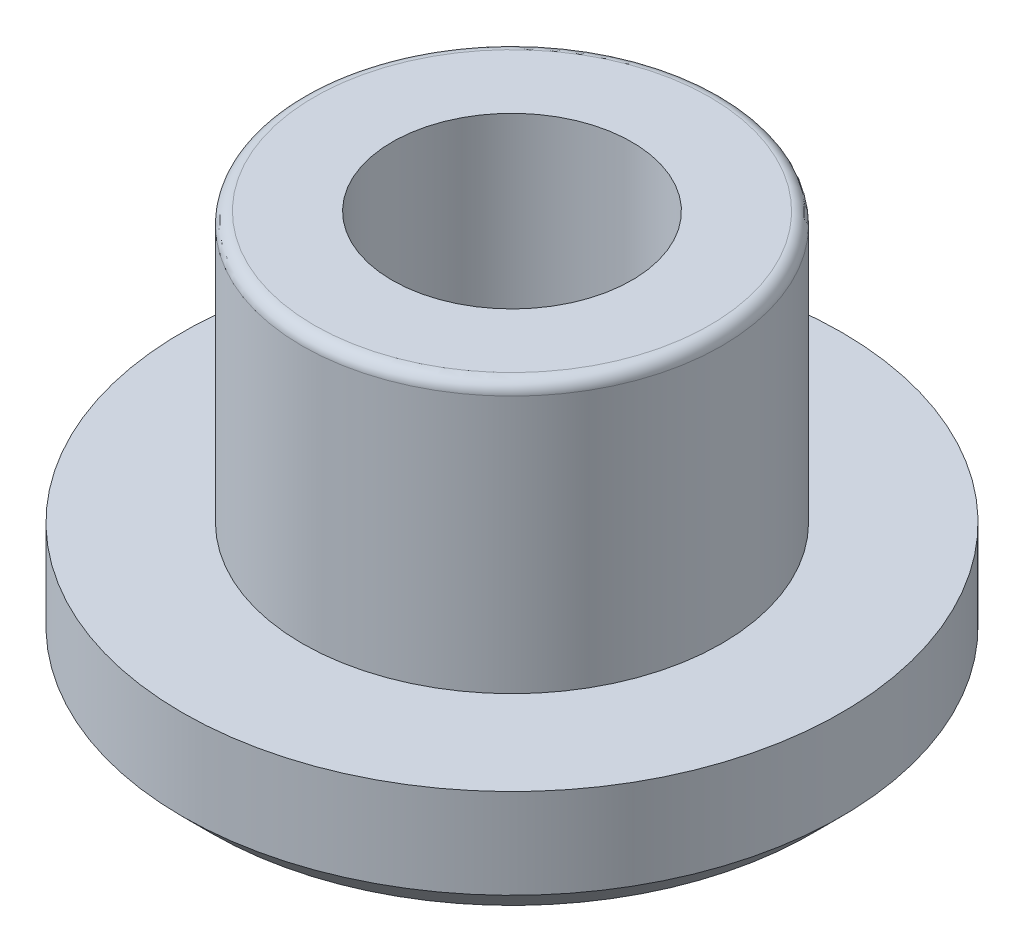
ISO-10303-21;
HEADER;
FILE_DESCRIPTION(('STEP AP214'),'2;1');
FILE_NAME('part.step','',(''),(''),'','','');
FILE_SCHEMA(('AUTOMOTIVE_DESIGN { 1 0 10303 214 1 1 1 1 }'));
ENDSEC;
DATA;
#1=APPLICATION_CONTEXT('core data for automotive mechanical design processes');
#2=APPLICATION_PROTOCOL_DEFINITION('international standard','automotive_design',2000,#1);
#3=PRODUCT_CONTEXT('',#1,'mechanical');
#4=PRODUCT('Part','Part','',(#3));
#5=PRODUCT_RELATED_PRODUCT_CATEGORY('part','',(#4));
#6=PRODUCT_DEFINITION_FORMATION('','',#4);
#7=PRODUCT_DEFINITION_CONTEXT('part definition',#1,'design');
#8=PRODUCT_DEFINITION('design','',#6,#7);
#9=PRODUCT_DEFINITION_SHAPE('','',#8);
#10=(LENGTH_UNIT() NAMED_UNIT(*) SI_UNIT(.MILLI.,.METRE.));
#11=(NAMED_UNIT(*) PLANE_ANGLE_UNIT() SI_UNIT($,.RADIAN.));
#12=(NAMED_UNIT(*) SI_UNIT($,.STERADIAN.) SOLID_ANGLE_UNIT());
#13=UNCERTAINTY_MEASURE_WITH_UNIT(LENGTH_MEASURE(1.E-05),#10,'distance_accuracy_value','');
#14=(GEOMETRIC_REPRESENTATION_CONTEXT(3) GLOBAL_UNCERTAINTY_ASSIGNED_CONTEXT((#13)) GLOBAL_UNIT_ASSIGNED_CONTEXT((#10,
#11,#12)) REPRESENTATION_CONTEXT('',''));
#15=CARTESIAN_POINT('',(0.,0.,0.));
#16=DIRECTION('',(0.,0.,1.));
#17=DIRECTION('',(1.,0.,0.));
#18=AXIS2_PLACEMENT_3D('',#15,#16,#17);
#19=CARTESIAN_POINT('',(0.,2.,0.));
#20=DIRECTION('',(0.,1.,0.));
#21=DIRECTION('',(0.,0.,1.));
#22=AXIS2_PLACEMENT_3D('',#19,#20,#21);
#23=PLANE('',#22);
#24=CARTESIAN_POINT('',(0.,2.,0.));
#25=DIRECTION('',(0.,1.,0.));
#26=DIRECTION('',(0.,0.,1.));
#27=AXIS2_PLACEMENT_3D('',#24,#25,#26);
#28=CIRCLE('',#27,5.5);
#29=CARTESIAN_POINT('',(0.,2.,5.5));
#30=VERTEX_POINT('',#29);
#31=EDGE_CURVE('E52',#30,#30,#28,.T.);
#32=ORIENTED_EDGE('',*,*,#31,.T.);
#33=EDGE_LOOP('',(#32));
#34=FACE_BOUND('',#33,.T.);
#35=CARTESIAN_POINT('',(0.,2.,0.));
#36=DIRECTION('',(0.,1.,0.));
#37=DIRECTION('',(0.,0.,1.));
#38=AXIS2_PLACEMENT_3D('',#35,#36,#37);
#39=CIRCLE('',#38,3.5);
#40=CARTESIAN_POINT('',(0.,2.,3.5));
#41=VERTEX_POINT('',#40);
#42=EDGE_CURVE('E55',#41,#41,#39,.T.);
#43=ORIENTED_EDGE('',*,*,#42,.F.);
#44=EDGE_LOOP('',(#43));
#45=FACE_BOUND('',#44,.T.);
#46=ADVANCED_FACE('F32',(#34,#45),#23,.T.);
#47=CARTESIAN_POINT('',(0.,2.,0.));
#48=DIRECTION('',(0.,-1.,0.));
#49=DIRECTION('',(0.,0.,-1.));
#50=AXIS2_PLACEMENT_3D('',#47,#48,#49);
#51=CYLINDRICAL_SURFACE('',#50,5.5);
#52=CARTESIAN_POINT('',(0.,0.500000000000001,0.));
#53=DIRECTION('',(0.,1.,0.));
#54=DIRECTION('',(0.,0.,1.));
#55=AXIS2_PLACEMENT_3D('',#52,#53,#54);
#56=CIRCLE('',#55,5.5);
#57=CARTESIAN_POINT('',(0.,0.500000000000001,5.5));
#58=VERTEX_POINT('',#57);
#59=EDGE_CURVE('E47',#58,#58,#56,.T.);
#60=ORIENTED_EDGE('',*,*,#59,.T.);
#61=EDGE_LOOP('',(#60));
#62=FACE_BOUND('',#61,.T.);
#63=ORIENTED_EDGE('',*,*,#31,.F.);
#64=EDGE_LOOP('',(#63));
#65=FACE_BOUND('',#64,.T.);
#66=ADVANCED_FACE('F83',(#62,#65),#51,.T.);
#67=CARTESIAN_POINT('',(0.,0.,0.));
#68=DIRECTION('',(0.,1.,0.));
#69=DIRECTION('',(0.,0.,1.));
#70=AXIS2_PLACEMENT_3D('',#67,#68,#69);
#71=PLANE('',#70);
#72=CARTESIAN_POINT('',(0.,0.,0.));
#73=DIRECTION('',(0.,1.,0.));
#74=DIRECTION('',(0.,0.,1.));
#75=AXIS2_PLACEMENT_3D('',#72,#73,#74);
#76=CIRCLE('',#75,5.);
#77=CARTESIAN_POINT('',(0.,0.,5.));
#78=VERTEX_POINT('',#77);
#79=EDGE_CURVE('E43',#78,#78,#76,.F.);
#80=ORIENTED_EDGE('',*,*,#79,.T.);
#81=EDGE_LOOP('',(#80));
#82=FACE_BOUND('',#81,.T.);
#83=ADVANCED_FACE('F80',(#82),#71,.F.);
#84=CARTESIAN_POINT('',(0.,6.5,0.));
#85=DIRECTION('',(0.,-1.,0.));
#86=DIRECTION('',(0.,0.,-1.));
#87=AXIS2_PLACEMENT_3D('',#84,#85,#86);
#88=CYLINDRICAL_SURFACE('',#87,3.5);
#89=CARTESIAN_POINT('',(0.,6.3,0.));
#90=DIRECTION('',(0.,1.,0.));
#91=DIRECTION('',(0.,0.,1.));
#92=AXIS2_PLACEMENT_3D('',#89,#90,#91);
#93=CIRCLE('',#92,3.5);
#94=CARTESIAN_POINT('',(0.,6.3,3.5));
#95=VERTEX_POINT('',#94);
#96=EDGE_CURVE('E10',#95,#95,#93,.F.);
#97=ORIENTED_EDGE('',*,*,#96,.T.);
#98=EDGE_LOOP('',(#97));
#99=FACE_BOUND('',#98,.T.);
#100=ORIENTED_EDGE('',*,*,#42,.T.);
#101=EDGE_LOOP('',(#100));
#102=FACE_BOUND('',#101,.T.);
#103=ADVANCED_FACE('F75',(#99,#102),#88,.T.);
#104=CARTESIAN_POINT('',(0.,6.5,0.));
#105=DIRECTION('',(0.,1.,0.));
#106=DIRECTION('',(0.,0.,1.));
#107=AXIS2_PLACEMENT_3D('',#104,#105,#106);
#108=PLANE('',#107);
#109=CARTESIAN_POINT('',(0.,6.5,0.));
#110=DIRECTION('',(0.,1.,0.));
#111=DIRECTION('',(0.,0.,1.));
#112=AXIS2_PLACEMENT_3D('',#109,#110,#111);
#113=CIRCLE('',#112,3.3);
#114=CARTESIAN_POINT('',(0.,6.5,3.3));
#115=VERTEX_POINT('',#114);
#116=EDGE_CURVE('E39',#115,#115,#113,.T.);
#117=ORIENTED_EDGE('',*,*,#116,.T.);
#118=EDGE_LOOP('',(#117));
#119=FACE_BOUND('',#118,.T.);
#120=CARTESIAN_POINT('',(0.,6.5,0.));
#121=DIRECTION('',(0.,1.,0.));
#122=DIRECTION('',(0.,0.,1.));
#123=AXIS2_PLACEMENT_3D('',#120,#121,#122);
#124=CIRCLE('',#123,2.);
#125=CARTESIAN_POINT('',(0.,6.5,2.));
#126=VERTEX_POINT('',#125);
#127=EDGE_CURVE('E59',#126,#126,#124,.T.);
#128=ORIENTED_EDGE('',*,*,#127,.F.);
#129=EDGE_LOOP('',(#128));
#130=FACE_BOUND('',#129,.T.);
#131=ADVANCED_FACE('F70',(#119,#130),#108,.T.);
#132=CARTESIAN_POINT('',(0.,1.5,0.));
#133=DIRECTION('',(0.,1.,0.));
#134=DIRECTION('',(0.,0.,1.));
#135=AXIS2_PLACEMENT_3D('',#132,#133,#134);
#136=CYLINDRICAL_SURFACE('',#135,2.);
#137=CARTESIAN_POINT('',(0.,1.5,0.));
#138=DIRECTION('',(0.,1.,0.));
#139=DIRECTION('',(0.,0.,1.));
#140=AXIS2_PLACEMENT_3D('',#137,#138,#139);
#141=CIRCLE('',#140,2.);
#142=CARTESIAN_POINT('',(0.,1.5,2.));
#143=VERTEX_POINT('',#142);
#144=EDGE_CURVE('E58',#143,#143,#141,.T.);
#145=ORIENTED_EDGE('',*,*,#144,.F.);
#146=EDGE_LOOP('',(#145));
#147=FACE_BOUND('',#146,.T.);
#148=ORIENTED_EDGE('',*,*,#127,.T.);
#149=EDGE_LOOP('',(#148));
#150=FACE_BOUND('',#149,.T.);
#151=ADVANCED_FACE('F67',(#147,#150),#136,.F.);
#152=CARTESIAN_POINT('',(0.,1.5,0.));
#153=DIRECTION('',(0.,1.,0.));
#154=DIRECTION('',(0.,0.,1.));
#155=AXIS2_PLACEMENT_3D('',#152,#153,#154);
#156=PLANE('',#155);
#157=ORIENTED_EDGE('',*,*,#144,.T.);
#158=EDGE_LOOP('',(#157));
#159=FACE_BOUND('',#158,.T.);
#160=ADVANCED_FACE('F65',(#159),#156,.T.);
#161=CARTESIAN_POINT('',(0.,0.500000000000001,0.));
#162=DIRECTION('',(0.,1.,0.));
#163=DIRECTION('',(0.,0.,1.));
#164=AXIS2_PLACEMENT_3D('',#161,#162,#163);
#165=CONICAL_SURFACE('',#164,5.5,0.785398163397449);
#166=ORIENTED_EDGE('',*,*,#79,.F.);
#167=EDGE_LOOP('',(#166));
#168=FACE_BOUND('',#167,.T.);
#169=ORIENTED_EDGE('',*,*,#59,.F.);
#170=EDGE_LOOP('',(#169));
#171=FACE_BOUND('',#170,.T.);
#172=ADVANCED_FACE('F95',(#168,#171),#165,.T.);
#173=CARTESIAN_POINT('',(0.,6.3,0.));
#174=DIRECTION('',(0.,1.,0.));
#175=DIRECTION('',(0.,0.,1.));
#176=AXIS2_PLACEMENT_3D('',#173,#174,#175);
#177=TOROIDAL_SURFACE('',#176,3.3,0.2);
#178=ORIENTED_EDGE('',*,*,#96,.F.);
#179=EDGE_LOOP('',(#178));
#180=FACE_BOUND('',#179,.T.);
#181=ORIENTED_EDGE('',*,*,#116,.F.);
#182=EDGE_LOOP('',(#181));
#183=FACE_BOUND('',#182,.T.);
#184=ADVANCED_FACE('F34',(#180,#183),#177,.T.);
#185=CLOSED_SHELL('',(#46,#66,#83,#103,#131,#151,#160,#172,#184));
#186=MANIFOLD_SOLID_BREP('B2',#185);
#187=ADVANCED_BREP_SHAPE_REPRESENTATION('',(#18,#186),#14);
#188=SHAPE_DEFINITION_REPRESENTATION(#9,#187);
ENDSEC;
END-ISO-10303-21;
